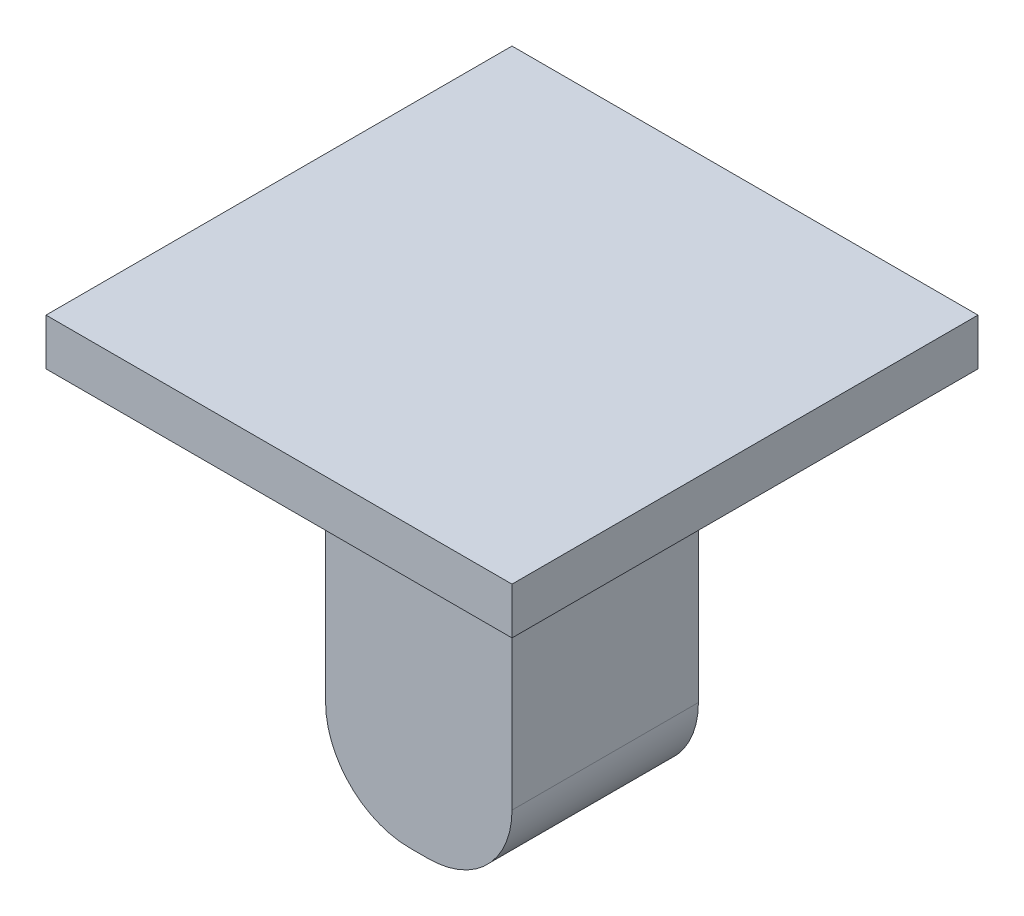
ISO-10303-21;
HEADER;
FILE_DESCRIPTION(('STEP AP214'),'2;1');
FILE_NAME('part.step','',(''),(''),'','','');
FILE_SCHEMA(('AUTOMOTIVE_DESIGN { 1 0 10303 214 1 1 1 1 }'));
ENDSEC;
DATA;
#1=APPLICATION_CONTEXT('core data for automotive mechanical design processes');
#2=APPLICATION_PROTOCOL_DEFINITION('international standard','automotive_design',2000,#1);
#3=PRODUCT_CONTEXT('',#1,'mechanical');
#4=PRODUCT('Part','Part','',(#3));
#5=PRODUCT_RELATED_PRODUCT_CATEGORY('part','',(#4));
#6=PRODUCT_DEFINITION_FORMATION('','',#4);
#7=PRODUCT_DEFINITION_CONTEXT('part definition',#1,'design');
#8=PRODUCT_DEFINITION('design','',#6,#7);
#9=PRODUCT_DEFINITION_SHAPE('','',#8);
#10=(LENGTH_UNIT() NAMED_UNIT(*) SI_UNIT(.MILLI.,.METRE.));
#11=(NAMED_UNIT(*) PLANE_ANGLE_UNIT() SI_UNIT($,.RADIAN.));
#12=(NAMED_UNIT(*) SI_UNIT($,.STERADIAN.) SOLID_ANGLE_UNIT());
#13=UNCERTAINTY_MEASURE_WITH_UNIT(LENGTH_MEASURE(1.E-05),#10,'distance_accuracy_value','');
#14=(GEOMETRIC_REPRESENTATION_CONTEXT(3) GLOBAL_UNCERTAINTY_ASSIGNED_CONTEXT((#13)) GLOBAL_UNIT_ASSIGNED_CONTEXT((#10,
#11,#12)) REPRESENTATION_CONTEXT('',''));
#15=CARTESIAN_POINT('',(0.,0.,0.));
#16=DIRECTION('',(0.,0.,1.));
#17=DIRECTION('',(1.,0.,0.));
#18=AXIS2_PLACEMENT_3D('',#15,#16,#17);
#19=CARTESIAN_POINT('',(20.,9.00000000000006,20.));
#20=DIRECTION('',(-1.,0.,0.));
#21=DIRECTION('',(0.,0.,1.));
#22=AXIS2_PLACEMENT_3D('',#19,#20,#21);
#23=PLANE('',#22);
#24=DIRECTION('',(0.,1.,0.));
#25=VECTOR('',#24,1.);
#26=CARTESIAN_POINT('',(20.,9.00000000000006,0.));
#27=LINE('',#26,#25);
#28=CARTESIAN_POINT('',(20.,9.00000000000006,0.));
#29=VERTEX_POINT('',#28);
#30=CARTESIAN_POINT('',(20.,40.,0.));
#31=VERTEX_POINT('',#30);
#32=EDGE_CURVE('E118',#29,#31,#27,.T.);
#33=ORIENTED_EDGE('',*,*,#32,.T.);
#34=DIRECTION('',(0.,0.,-1.));
#35=VECTOR('',#34,1.);
#36=CARTESIAN_POINT('',(20.,40.,20.));
#37=LINE('',#36,#35);
#38=CARTESIAN_POINT('',(20.,40.,20.));
#39=VERTEX_POINT('',#38);
#40=EDGE_CURVE('E11',#39,#31,#37,.T.);
#41=ORIENTED_EDGE('',*,*,#40,.F.);
#42=DIRECTION('',(0.,1.,0.));
#43=VECTOR('',#42,1.);
#44=CARTESIAN_POINT('',(20.,9.00000000000006,20.));
#45=LINE('',#44,#43);
#46=CARTESIAN_POINT('',(20.,9.00000000000006,20.));
#47=VERTEX_POINT('',#46);
#48=EDGE_CURVE('E84',#47,#39,#45,.T.);
#49=ORIENTED_EDGE('',*,*,#48,.F.);
#50=DIRECTION('',(0.,0.,-1.));
#51=VECTOR('',#50,1.);
#52=CARTESIAN_POINT('',(20.,9.00000000000006,20.));
#53=LINE('',#52,#51);
#54=EDGE_CURVE('E114',#47,#29,#53,.T.);
#55=ORIENTED_EDGE('',*,*,#54,.T.);
#56=EDGE_LOOP('',(#33,#41,#49,#55));
#57=FACE_BOUND('',#56,.T.);
#58=ADVANCED_FACE('F35',(#57),#23,.F.);
#59=CARTESIAN_POINT('',(0.,9.00000000000006,20.));
#60=DIRECTION('',(1.,0.,0.));
#61=DIRECTION('',(0.,0.,-1.));
#62=AXIS2_PLACEMENT_3D('',#59,#60,#61);
#63=PLANE('',#62);
#64=DIRECTION('',(0.,-1.,0.));
#65=VECTOR('',#64,1.);
#66=CARTESIAN_POINT('',(0.,9.00000000000006,0.));
#67=LINE('',#66,#65);
#68=CARTESIAN_POINT('',(0.,40.,0.));
#69=VERTEX_POINT('',#68);
#70=CARTESIAN_POINT('',(0.,9.00000000000006,0.));
#71=VERTEX_POINT('',#70);
#72=EDGE_CURVE('E125',#69,#71,#67,.T.);
#73=ORIENTED_EDGE('',*,*,#72,.T.);
#74=DIRECTION('',(0.,0.,-1.));
#75=VECTOR('',#74,1.);
#76=CARTESIAN_POINT('',(0.,9.00000000000006,20.));
#77=LINE('',#76,#75);
#78=CARTESIAN_POINT('',(0.,9.00000000000006,20.));
#79=VERTEX_POINT('',#78);
#80=EDGE_CURVE('E109',#79,#71,#77,.T.);
#81=ORIENTED_EDGE('',*,*,#80,.F.);
#82=DIRECTION('',(0.,-1.,0.));
#83=VECTOR('',#82,1.);
#84=CARTESIAN_POINT('',(0.,9.00000000000006,20.));
#85=LINE('',#84,#83);
#86=CARTESIAN_POINT('',(0.,40.,20.));
#87=VERTEX_POINT('',#86);
#88=EDGE_CURVE('E100',#87,#79,#85,.T.);
#89=ORIENTED_EDGE('',*,*,#88,.F.);
#90=DIRECTION('',(0.,0.,-1.));
#91=VECTOR('',#90,1.);
#92=CARTESIAN_POINT('',(0.,40.,20.));
#93=LINE('',#92,#91);
#94=EDGE_CURVE('E43',#87,#69,#93,.T.);
#95=ORIENTED_EDGE('',*,*,#94,.T.);
#96=EDGE_LOOP('',(#73,#81,#89,#95));
#97=FACE_BOUND('',#96,.T.);
#98=ADVANCED_FACE('F135',(#97),#63,.F.);
#99=CARTESIAN_POINT('',(9.,9.,20.));
#100=DIRECTION('',(0.,0.,-1.));
#101=DIRECTION('',(-1.,0.,0.));
#102=AXIS2_PLACEMENT_3D('',#99,#100,#101);
#103=CYLINDRICAL_SURFACE('',#102,9.);
#104=CARTESIAN_POINT('',(9.,9.,0.));
#105=DIRECTION('',(0.,0.,1.));
#106=DIRECTION('',(-1.,0.,0.));
#107=AXIS2_PLACEMENT_3D('',#104,#105,#106);
#108=CIRCLE('',#107,9.);
#109=CARTESIAN_POINT('',(9.00000000000007,0.,0.));
#110=VERTEX_POINT('',#109);
#111=EDGE_CURVE('E108',#71,#110,#108,.T.);
#112=ORIENTED_EDGE('',*,*,#111,.T.);
#113=DIRECTION('',(0.,0.,-1.));
#114=VECTOR('',#113,1.);
#115=CARTESIAN_POINT('',(9.00000000000007,0.,20.));
#116=LINE('',#115,#114);
#117=CARTESIAN_POINT('',(9.00000000000007,0.,20.));
#118=VERTEX_POINT('',#117);
#119=EDGE_CURVE('E105',#118,#110,#116,.T.);
#120=ORIENTED_EDGE('',*,*,#119,.F.);
#121=CARTESIAN_POINT('',(9.,9.,20.));
#122=DIRECTION('',(0.,0.,1.));
#123=DIRECTION('',(-1.,0.,0.));
#124=AXIS2_PLACEMENT_3D('',#121,#122,#123);
#125=CIRCLE('',#124,9.);
#126=EDGE_CURVE('E94',#79,#118,#125,.T.);
#127=ORIENTED_EDGE('',*,*,#126,.F.);
#128=ORIENTED_EDGE('',*,*,#80,.T.);
#129=EDGE_LOOP('',(#112,#120,#127,#128));
#130=FACE_BOUND('',#129,.T.);
#131=ADVANCED_FACE('F106',(#130),#103,.T.);
#132=CARTESIAN_POINT('',(9.00000000000006,0.,20.));
#133=DIRECTION('',(0.,1.,0.));
#134=DIRECTION('',(0.,0.,1.));
#135=AXIS2_PLACEMENT_3D('',#132,#133,#134);
#136=PLANE('',#135);
#137=DIRECTION('',(1.,0.,0.));
#138=VECTOR('',#137,1.);
#139=CARTESIAN_POINT('',(9.00000000000006,0.,0.));
#140=LINE('',#139,#138);
#141=CARTESIAN_POINT('',(10.9999999999999,0.,0.));
#142=VERTEX_POINT('',#141);
#143=EDGE_CURVE('E72',#110,#142,#140,.T.);
#144=ORIENTED_EDGE('',*,*,#143,.T.);
#145=DIRECTION('',(0.,0.,-1.));
#146=VECTOR('',#145,1.);
#147=CARTESIAN_POINT('',(10.9999999999999,0.,20.));
#148=LINE('',#147,#146);
#149=CARTESIAN_POINT('',(10.9999999999999,0.,20.));
#150=VERTEX_POINT('',#149);
#151=EDGE_CURVE('E110',#150,#142,#148,.T.);
#152=ORIENTED_EDGE('',*,*,#151,.F.);
#153=DIRECTION('',(1.,0.,0.));
#154=VECTOR('',#153,1.);
#155=CARTESIAN_POINT('',(9.00000000000006,0.,20.));
#156=LINE('',#155,#154);
#157=EDGE_CURVE('E98',#118,#150,#156,.T.);
#158=ORIENTED_EDGE('',*,*,#157,.F.);
#159=ORIENTED_EDGE('',*,*,#119,.T.);
#160=EDGE_LOOP('',(#144,#152,#158,#159));
#161=FACE_BOUND('',#160,.T.);
#162=ADVANCED_FACE('F112',(#161),#136,.F.);
#163=CARTESIAN_POINT('',(11.,9.,20.));
#164=DIRECTION('',(0.,0.,-1.));
#165=DIRECTION('',(-1.,0.,0.));
#166=AXIS2_PLACEMENT_3D('',#163,#164,#165);
#167=CYLINDRICAL_SURFACE('',#166,9.);
#168=CARTESIAN_POINT('',(11.,9.,0.));
#169=DIRECTION('',(0.,0.,1.));
#170=DIRECTION('',(1.,0.,0.));
#171=AXIS2_PLACEMENT_3D('',#168,#169,#170);
#172=CIRCLE('',#171,9.);
#173=EDGE_CURVE('E78',#142,#29,#172,.T.);
#174=ORIENTED_EDGE('',*,*,#173,.T.);
#175=ORIENTED_EDGE('',*,*,#54,.F.);
#176=CARTESIAN_POINT('',(11.,9.,20.));
#177=DIRECTION('',(0.,0.,1.));
#178=DIRECTION('',(1.,0.,0.));
#179=AXIS2_PLACEMENT_3D('',#176,#177,#178);
#180=CIRCLE('',#179,9.);
#181=EDGE_CURVE('E51',#150,#47,#180,.T.);
#182=ORIENTED_EDGE('',*,*,#181,.F.);
#183=ORIENTED_EDGE('',*,*,#151,.T.);
#184=EDGE_LOOP('',(#174,#175,#182,#183));
#185=FACE_BOUND('',#184,.T.);
#186=ADVANCED_FACE('F145',(#185),#167,.T.);
#187=CARTESIAN_POINT('',(9.,9.,20.));
#188=DIRECTION('',(0.,0.,-1.));
#189=DIRECTION('',(-1.,0.,0.));
#190=AXIS2_PLACEMENT_3D('',#187,#188,#189);
#191=PLANE('',#190);
#192=ORIENTED_EDGE('',*,*,#48,.T.);
#193=DIRECTION('',(-1.,0.,0.));
#194=VECTOR('',#193,1.);
#195=CARTESIAN_POINT('',(0.,40.,20.));
#196=LINE('',#195,#194);
#197=EDGE_CURVE('E291',#39,#87,#196,.T.);
#198=ORIENTED_EDGE('',*,*,#197,.T.);
#199=ORIENTED_EDGE('',*,*,#88,.T.);
#200=ORIENTED_EDGE('',*,*,#126,.T.);
#201=ORIENTED_EDGE('',*,*,#157,.T.);
#202=ORIENTED_EDGE('',*,*,#181,.T.);
#203=EDGE_LOOP('',(#192,#198,#199,#200,#201,#202));
#204=FACE_BOUND('',#203,.T.);
#205=ADVANCED_FACE('F96',(#204),#191,.F.);
#206=CARTESIAN_POINT('',(9.,9.,0.));
#207=DIRECTION('',(0.,0.,-1.));
#208=DIRECTION('',(-1.,0.,0.));
#209=AXIS2_PLACEMENT_3D('',#206,#207,#208);
#210=PLANE('',#209);
#211=ORIENTED_EDGE('',*,*,#32,.F.);
#212=ORIENTED_EDGE('',*,*,#173,.F.);
#213=ORIENTED_EDGE('',*,*,#143,.F.);
#214=ORIENTED_EDGE('',*,*,#111,.F.);
#215=ORIENTED_EDGE('',*,*,#72,.F.);
#216=DIRECTION('',(-1.,0.,0.));
#217=VECTOR('',#216,1.);
#218=CARTESIAN_POINT('',(0.,40.,0.));
#219=LINE('',#218,#217);
#220=EDGE_CURVE('E121',#31,#69,#219,.T.);
#221=ORIENTED_EDGE('',*,*,#220,.F.);
#222=EDGE_LOOP('',(#211,#212,#213,#214,#215,#221));
#223=FACE_BOUND('',#222,.T.);
#224=ADVANCED_FACE('F143',(#223),#210,.T.);
#225=CARTESIAN_POINT('',(0.,40.,0.));
#226=DIRECTION('',(0.,-1.,0.));
#227=DIRECTION('',(0.,0.,-1.));
#228=AXIS2_PLACEMENT_3D('',#225,#226,#227);
#229=PLANE('',#228);
#230=DIRECTION('',(0.,0.,1.));
#231=VECTOR('',#230,1.);
#232=CARTESIAN_POINT('',(-15.,40.,35.));
#233=LINE('',#232,#231);
#234=CARTESIAN_POINT('',(-15.,40.,-15.));
#235=VERTEX_POINT('',#234);
#236=CARTESIAN_POINT('',(-15.,40.,35.));
#237=VERTEX_POINT('',#236);
#238=EDGE_CURVE('E281',#235,#237,#233,.T.);
#239=ORIENTED_EDGE('',*,*,#238,.F.);
#240=DIRECTION('',(-1.,0.,0.));
#241=VECTOR('',#240,1.);
#242=CARTESIAN_POINT('',(-15.,40.,-15.));
#243=LINE('',#242,#241);
#244=CARTESIAN_POINT('',(35.,40.,-15.));
#245=VERTEX_POINT('',#244);
#246=EDGE_CURVE('E275',#245,#235,#243,.T.);
#247=ORIENTED_EDGE('',*,*,#246,.F.);
#248=DIRECTION('',(0.,0.,-1.));
#249=VECTOR('',#248,1.);
#250=CARTESIAN_POINT('',(35.,40.,35.));
#251=LINE('',#250,#249);
#252=CARTESIAN_POINT('',(35.,40.,35.));
#253=VERTEX_POINT('',#252);
#254=EDGE_CURVE('E298',#253,#245,#251,.T.);
#255=ORIENTED_EDGE('',*,*,#254,.F.);
#256=DIRECTION('',(1.,0.,0.));
#257=VECTOR('',#256,1.);
#258=CARTESIAN_POINT('',(-15.,40.,35.));
#259=LINE('',#258,#257);
#260=EDGE_CURVE('E301',#237,#253,#259,.T.);
#261=ORIENTED_EDGE('',*,*,#260,.F.);
#262=EDGE_LOOP('',(#239,#247,#255,#261));
#263=FACE_BOUND('',#262,.T.);
#264=ORIENTED_EDGE('',*,*,#197,.F.);
#265=ORIENTED_EDGE('',*,*,#40,.T.);
#266=ORIENTED_EDGE('',*,*,#220,.T.);
#267=ORIENTED_EDGE('',*,*,#94,.F.);
#268=EDGE_LOOP('',(#264,#265,#266,#267));
#269=FACE_BOUND('',#268,.T.);
#270=ADVANCED_FACE('F140',(#263,#269),#229,.T.);
#271=CARTESIAN_POINT('',(-15.,45.,35.));
#272=DIRECTION('',(1.,0.,0.));
#273=DIRECTION('',(0.,0.,-1.));
#274=AXIS2_PLACEMENT_3D('',#271,#272,#273);
#275=PLANE('',#274);
#276=ORIENTED_EDGE('',*,*,#238,.T.);
#277=DIRECTION('',(0.,-1.,0.));
#278=VECTOR('',#277,1.);
#279=CARTESIAN_POINT('',(-15.,45.,35.));
#280=LINE('',#279,#278);
#281=CARTESIAN_POINT('',(-15.,45.,35.));
#282=VERTEX_POINT('',#281);
#283=EDGE_CURVE('E122',#282,#237,#280,.T.);
#284=ORIENTED_EDGE('',*,*,#283,.F.);
#285=DIRECTION('',(0.,0.,1.));
#286=VECTOR('',#285,1.);
#287=CARTESIAN_POINT('',(-15.,45.,35.));
#288=LINE('',#287,#286);
#289=CARTESIAN_POINT('',(-15.,45.,-15.));
#290=VERTEX_POINT('',#289);
#291=EDGE_CURVE('E262',#290,#282,#288,.T.);
#292=ORIENTED_EDGE('',*,*,#291,.F.);
#293=DIRECTION('',(0.,-1.,0.));
#294=VECTOR('',#293,1.);
#295=CARTESIAN_POINT('',(-15.,45.,-15.));
#296=LINE('',#295,#294);
#297=EDGE_CURVE('E294',#290,#235,#296,.T.);
#298=ORIENTED_EDGE('',*,*,#297,.T.);
#299=EDGE_LOOP('',(#276,#284,#292,#298));
#300=FACE_BOUND('',#299,.T.);
#301=ADVANCED_FACE('F203',(#300),#275,.F.);
#302=CARTESIAN_POINT('',(-15.,45.,35.));
#303=DIRECTION('',(0.,0.,-1.));
#304=DIRECTION('',(-1.,0.,0.));
#305=AXIS2_PLACEMENT_3D('',#302,#303,#304);
#306=PLANE('',#305);
#307=ORIENTED_EDGE('',*,*,#260,.T.);
#308=DIRECTION('',(0.,-1.,0.));
#309=VECTOR('',#308,1.);
#310=CARTESIAN_POINT('',(35.,45.,35.));
#311=LINE('',#310,#309);
#312=CARTESIAN_POINT('',(35.,45.,35.));
#313=VERTEX_POINT('',#312);
#314=EDGE_CURVE('E283',#313,#253,#311,.T.);
#315=ORIENTED_EDGE('',*,*,#314,.F.);
#316=DIRECTION('',(1.,0.,0.));
#317=VECTOR('',#316,1.);
#318=CARTESIAN_POINT('',(-15.,45.,35.));
#319=LINE('',#318,#317);
#320=EDGE_CURVE('E267',#282,#313,#319,.T.);
#321=ORIENTED_EDGE('',*,*,#320,.F.);
#322=ORIENTED_EDGE('',*,*,#283,.T.);
#323=EDGE_LOOP('',(#307,#315,#321,#322));
#324=FACE_BOUND('',#323,.T.);
#325=ADVANCED_FACE('F213',(#324),#306,.F.);
#326=CARTESIAN_POINT('',(35.,45.,35.));
#327=DIRECTION('',(-1.,0.,0.));
#328=DIRECTION('',(0.,0.,1.));
#329=AXIS2_PLACEMENT_3D('',#326,#327,#328);
#330=PLANE('',#329);
#331=ORIENTED_EDGE('',*,*,#254,.T.);
#332=DIRECTION('',(0.,-1.,0.));
#333=VECTOR('',#332,1.);
#334=CARTESIAN_POINT('',(35.,45.,-15.));
#335=LINE('',#334,#333);
#336=CARTESIAN_POINT('',(35.,45.,-15.));
#337=VERTEX_POINT('',#336);
#338=EDGE_CURVE('E286',#337,#245,#335,.T.);
#339=ORIENTED_EDGE('',*,*,#338,.F.);
#340=DIRECTION('',(0.,0.,-1.));
#341=VECTOR('',#340,1.);
#342=CARTESIAN_POINT('',(35.,45.,35.));
#343=LINE('',#342,#341);
#344=EDGE_CURVE('E305',#313,#337,#343,.T.);
#345=ORIENTED_EDGE('',*,*,#344,.F.);
#346=ORIENTED_EDGE('',*,*,#314,.T.);
#347=EDGE_LOOP('',(#331,#339,#345,#346));
#348=FACE_BOUND('',#347,.T.);
#349=ADVANCED_FACE('F223',(#348),#330,.F.);
#350=CARTESIAN_POINT('',(-15.,45.,-15.));
#351=DIRECTION('',(0.,0.,1.));
#352=DIRECTION('',(1.,0.,0.));
#353=AXIS2_PLACEMENT_3D('',#350,#351,#352);
#354=PLANE('',#353);
#355=ORIENTED_EDGE('',*,*,#246,.T.);
#356=ORIENTED_EDGE('',*,*,#297,.F.);
#357=DIRECTION('',(-1.,0.,0.));
#358=VECTOR('',#357,1.);
#359=CARTESIAN_POINT('',(-15.,45.,-15.));
#360=LINE('',#359,#358);
#361=EDGE_CURVE('E270',#337,#290,#360,.T.);
#362=ORIENTED_EDGE('',*,*,#361,.F.);
#363=ORIENTED_EDGE('',*,*,#338,.T.);
#364=EDGE_LOOP('',(#355,#356,#362,#363));
#365=FACE_BOUND('',#364,.T.);
#366=ADVANCED_FACE('F233',(#365),#354,.F.);
#367=CARTESIAN_POINT('',(0.,45.,0.));
#368=DIRECTION('',(0.,-1.,0.));
#369=DIRECTION('',(0.,0.,-1.));
#370=AXIS2_PLACEMENT_3D('',#367,#368,#369);
#371=PLANE('',#370);
#372=ORIENTED_EDGE('',*,*,#291,.T.);
#373=ORIENTED_EDGE('',*,*,#320,.T.);
#374=ORIENTED_EDGE('',*,*,#344,.T.);
#375=ORIENTED_EDGE('',*,*,#361,.T.);
#376=EDGE_LOOP('',(#372,#373,#374,#375));
#377=FACE_BOUND('',#376,.T.);
#378=ADVANCED_FACE('F243',(#377),#371,.F.);
#379=CLOSED_SHELL('',(#58,#98,#131,#162,#186,#205,#224,#270,#301,#325,#349,#366,#378));
#380=MANIFOLD_SOLID_BREP('B2',#379);
#381=ADVANCED_BREP_SHAPE_REPRESENTATION('',(#18,#380),#14);
#382=SHAPE_DEFINITION_REPRESENTATION(#9,#381);
ENDSEC;
END-ISO-10303-21;
